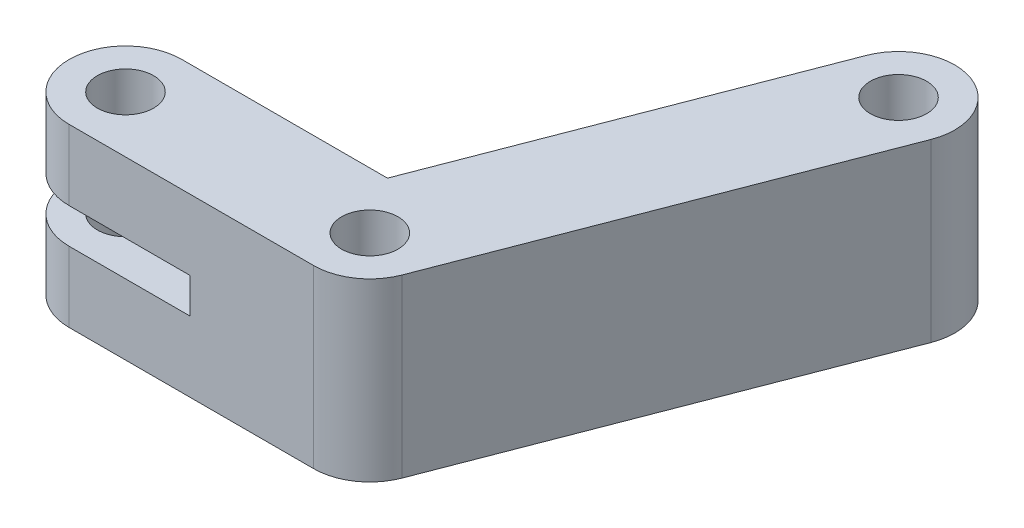
ISO-10303-21;
HEADER;
FILE_DESCRIPTION(('STEP AP214'),'2;1');
FILE_NAME('part.step','',(''),(''),'','','');
FILE_SCHEMA(('AUTOMOTIVE_DESIGN { 1 0 10303 214 1 1 1 1 }'));
ENDSEC;
DATA;
#1=APPLICATION_CONTEXT('core data for automotive mechanical design processes');
#2=APPLICATION_PROTOCOL_DEFINITION('international standard','automotive_design',2000,#1);
#3=PRODUCT_CONTEXT('',#1,'mechanical');
#4=PRODUCT('Part','Part','',(#3));
#5=PRODUCT_RELATED_PRODUCT_CATEGORY('part','',(#4));
#6=PRODUCT_DEFINITION_FORMATION('','',#4);
#7=PRODUCT_DEFINITION_CONTEXT('part definition',#1,'design');
#8=PRODUCT_DEFINITION('design','',#6,#7);
#9=PRODUCT_DEFINITION_SHAPE('','',#8);
#10=(LENGTH_UNIT() NAMED_UNIT(*) SI_UNIT(.MILLI.,.METRE.));
#11=(NAMED_UNIT(*) PLANE_ANGLE_UNIT() SI_UNIT($,.RADIAN.));
#12=(NAMED_UNIT(*) SI_UNIT($,.STERADIAN.) SOLID_ANGLE_UNIT());
#13=UNCERTAINTY_MEASURE_WITH_UNIT(LENGTH_MEASURE(1.E-05),#10,'distance_accuracy_value','');
#14=(GEOMETRIC_REPRESENTATION_CONTEXT(3) GLOBAL_UNCERTAINTY_ASSIGNED_CONTEXT((#13)) GLOBAL_UNIT_ASSIGNED_CONTEXT((#10,
#11,#12)) REPRESENTATION_CONTEXT('',''));
#15=CARTESIAN_POINT('',(0.,0.,0.));
#16=DIRECTION('',(0.,0.,1.));
#17=DIRECTION('',(1.,0.,0.));
#18=AXIS2_PLACEMENT_3D('',#15,#16,#17);
#19=CARTESIAN_POINT('',(0.,12.5,0.));
#20=DIRECTION('',(0.,-1.,0.));
#21=DIRECTION('',(0.,0.,-1.));
#22=AXIS2_PLACEMENT_3D('',#19,#20,#21);
#23=CYLINDRICAL_SURFACE('',#22,8.);
#24=DIRECTION('',(0.,-1.,0.));
#25=VECTOR('',#24,1.);
#26=CARTESIAN_POINT('',(0.,12.5,8.));
#27=LINE('',#26,#25);
#28=CARTESIAN_POINT('',(0.,-2.5,8.));
#29=VERTEX_POINT('',#28);
#30=CARTESIAN_POINT('',(0.,-12.5,8.));
#31=VERTEX_POINT('',#30);
#32=EDGE_CURVE('E47',#29,#31,#27,.T.);
#33=ORIENTED_EDGE('',*,*,#32,.F.);
#34=CARTESIAN_POINT('',(0.,-2.5,0.));
#35=DIRECTION('',(0.,-1.,0.));
#36=DIRECTION('',(0.,0.,-1.));
#37=AXIS2_PLACEMENT_3D('',#34,#35,#36);
#38=CIRCLE('',#37,8.);
#39=CARTESIAN_POINT('',(0.,-2.5,-8.));
#40=VERTEX_POINT('',#39);
#41=EDGE_CURVE('E273',#40,#29,#38,.F.);
#42=ORIENTED_EDGE('',*,*,#41,.F.);
#43=DIRECTION('',(0.,-1.,0.));
#44=VECTOR('',#43,1.);
#45=CARTESIAN_POINT('',(0.,12.5,-8.));
#46=LINE('',#45,#44);
#47=CARTESIAN_POINT('',(0.,-12.5,-8.));
#48=VERTEX_POINT('',#47);
#49=EDGE_CURVE('E94',#40,#48,#46,.T.);
#50=ORIENTED_EDGE('',*,*,#49,.T.);
#51=CARTESIAN_POINT('',(0.,-12.5,0.));
#52=DIRECTION('',(0.,1.,0.));
#53=DIRECTION('',(0.,0.,1.));
#54=AXIS2_PLACEMENT_3D('',#51,#52,#53);
#55=CIRCLE('',#54,8.);
#56=EDGE_CURVE('E143',#48,#31,#55,.T.);
#57=ORIENTED_EDGE('',*,*,#56,.T.);
#58=EDGE_LOOP('',(#33,#42,#50,#57));
#59=FACE_BOUND('',#58,.T.);
#60=ADVANCED_FACE('F39',(#59),#23,.T.);
#61=CARTESIAN_POINT('',(0.,12.5,0.));
#62=DIRECTION('',(0.,-1.,0.));
#63=DIRECTION('',(0.,0.,-1.));
#64=AXIS2_PLACEMENT_3D('',#61,#62,#63);
#65=CYLINDRICAL_SURFACE('',#64,4.);
#66=CARTESIAN_POINT('',(0.,-2.5,0.));
#67=DIRECTION('',(0.,-1.,0.));
#68=DIRECTION('',(0.,0.,-1.));
#69=AXIS2_PLACEMENT_3D('',#66,#67,#68);
#70=CIRCLE('',#69,4.);
#71=CARTESIAN_POINT('',(0.,-2.5,-4.));
#72=VERTEX_POINT('',#71);
#73=EDGE_CURVE('E270',#72,#72,#70,.F.);
#74=ORIENTED_EDGE('',*,*,#73,.T.);
#75=EDGE_LOOP('',(#74));
#76=FACE_BOUND('',#75,.T.);
#77=CARTESIAN_POINT('',(0.,-12.5,0.));
#78=DIRECTION('',(0.,1.,0.));
#79=DIRECTION('',(0.,0.,1.));
#80=AXIS2_PLACEMENT_3D('',#77,#78,#79);
#81=CIRCLE('',#80,4.);
#82=CARTESIAN_POINT('',(0.,-12.5,4.));
#83=VERTEX_POINT('',#82);
#84=EDGE_CURVE('E227',#83,#83,#81,.T.);
#85=ORIENTED_EDGE('',*,*,#84,.F.);
#86=EDGE_LOOP('',(#85));
#87=FACE_BOUND('',#86,.T.);
#88=ADVANCED_FACE('F185',(#76,#87),#65,.F.);
#89=CARTESIAN_POINT('',(0.,12.5,0.));
#90=DIRECTION('',(0.,1.,0.));
#91=DIRECTION('',(0.,0.,1.));
#92=AXIS2_PLACEMENT_3D('',#89,#90,#91);
#93=PLANE('',#92);
#94=CARTESIAN_POINT('',(0.,12.5,0.));
#95=DIRECTION('',(0.,1.,0.));
#96=DIRECTION('',(0.,0.,1.));
#97=AXIS2_PLACEMENT_3D('',#94,#95,#96);
#98=CIRCLE('',#97,4.);
#99=CARTESIAN_POINT('',(0.,12.5,4.));
#100=VERTEX_POINT('',#99);
#101=EDGE_CURVE('E229',#100,#100,#98,.T.);
#102=ORIENTED_EDGE('',*,*,#101,.F.);
#103=EDGE_LOOP('',(#102));
#104=FACE_BOUND('',#103,.T.);
#105=CARTESIAN_POINT('',(0.,12.5,0.));
#106=DIRECTION('',(0.,1.,0.));
#107=DIRECTION('',(0.,0.,1.));
#108=AXIS2_PLACEMENT_3D('',#105,#106,#107);
#109=CIRCLE('',#108,8.);
#110=CARTESIAN_POINT('',(0.,12.5,-8.));
#111=VERTEX_POINT('',#110);
#112=CARTESIAN_POINT('',(0.,12.5,8.));
#113=VERTEX_POINT('',#112);
#114=EDGE_CURVE('E157',#111,#113,#109,.T.);
#115=ORIENTED_EDGE('',*,*,#114,.T.);
#116=DIRECTION('',(1.,0.,0.));
#117=VECTOR('',#116,1.);
#118=CARTESIAN_POINT('',(0.,12.5,8.));
#119=LINE('',#118,#117);
#120=CARTESIAN_POINT('',(34.72,12.5,8.));
#121=VERTEX_POINT('',#120);
#122=EDGE_CURVE('E102',#113,#121,#119,.T.);
#123=ORIENTED_EDGE('',*,*,#122,.T.);
#124=CARTESIAN_POINT('',(34.72,12.5,0.));
#125=DIRECTION('',(0.,1.,0.));
#126=DIRECTION('',(0.,0.,-1.));
#127=AXIS2_PLACEMENT_3D('',#124,#125,#126);
#128=CIRCLE('',#127,8.);
#129=CARTESIAN_POINT('',(42.1854515483824,12.5,2.87524489022324));
#130=VERTEX_POINT('',#129);
#131=EDGE_CURVE('E241',#121,#130,#128,.T.);
#132=ORIENTED_EDGE('',*,*,#131,.T.);
#133=DIRECTION('',(0.359405611277904,0.,-0.9331814435478));
#134=VECTOR('',#133,1.);
#135=CARTESIAN_POINT('',(63.0754515483824,12.5,-51.3647551097768));
#136=LINE('',#135,#134);
#137=CARTESIAN_POINT('',(63.0754515483824,12.5,-51.3647551097768));
#138=VERTEX_POINT('',#137);
#139=EDGE_CURVE('E122',#130,#138,#136,.T.);
#140=ORIENTED_EDGE('',*,*,#139,.T.);
#141=CARTESIAN_POINT('',(55.61,12.5,-54.24));
#142=DIRECTION('',(0.,1.,0.));
#143=DIRECTION('',(0.,0.,-1.));
#144=AXIS2_PLACEMENT_3D('',#141,#142,#143);
#145=CIRCLE('',#144,8.);
#146=CARTESIAN_POINT('',(48.1445484516176,12.5,-57.1152448902232));
#147=VERTEX_POINT('',#146);
#148=EDGE_CURVE('E114',#138,#147,#145,.T.);
#149=ORIENTED_EDGE('',*,*,#148,.T.);
#150=DIRECTION('',(-0.359405611277904,0.,0.9331814435478));
#151=VECTOR('',#150,1.);
#152=CARTESIAN_POINT('',(29.2282972392879,12.5,-8.));
#153=LINE('',#152,#151);
#154=CARTESIAN_POINT('',(29.2282972392879,12.5,-8.));
#155=VERTEX_POINT('',#154);
#156=EDGE_CURVE('E119',#147,#155,#153,.T.);
#157=ORIENTED_EDGE('',*,*,#156,.T.);
#158=DIRECTION('',(-1.,0.,0.));
#159=VECTOR('',#158,1.);
#160=CARTESIAN_POINT('',(0.,12.5,-8.));
#161=LINE('',#160,#159);
#162=EDGE_CURVE('E63',#155,#111,#161,.T.);
#163=ORIENTED_EDGE('',*,*,#162,.T.);
#164=EDGE_LOOP('',(#115,#123,#132,#140,#149,#157,#163));
#165=FACE_BOUND('',#164,.T.);
#166=CARTESIAN_POINT('',(55.61,12.5,-54.24));
#167=DIRECTION('',(0.,1.,0.));
#168=DIRECTION('',(0.,0.,1.));
#169=AXIS2_PLACEMENT_3D('',#166,#167,#168);
#170=CIRCLE('',#169,4.00000000000001);
#171=CARTESIAN_POINT('',(55.61,12.5,-50.24));
#172=VERTEX_POINT('',#171);
#173=EDGE_CURVE('E146',#172,#172,#170,.T.);
#174=ORIENTED_EDGE('',*,*,#173,.F.);
#175=EDGE_LOOP('',(#174));
#176=FACE_BOUND('',#175,.T.);
#177=CARTESIAN_POINT('',(34.72,12.5,0.));
#178=DIRECTION('',(0.,1.,0.));
#179=DIRECTION('',(0.,0.,1.));
#180=AXIS2_PLACEMENT_3D('',#177,#178,#179);
#181=CIRCLE('',#180,4.00000000000001);
#182=CARTESIAN_POINT('',(34.72,12.5,4.00000000000001));
#183=VERTEX_POINT('',#182);
#184=EDGE_CURVE('E217',#183,#183,#181,.T.);
#185=ORIENTED_EDGE('',*,*,#184,.F.);
#186=EDGE_LOOP('',(#185));
#187=FACE_BOUND('',#186,.T.);
#188=ADVANCED_FACE('F116',(#104,#165,#176,#187),#93,.T.);
#189=CARTESIAN_POINT('',(0.,-12.5,0.));
#190=DIRECTION('',(0.,1.,0.));
#191=DIRECTION('',(0.,0.,1.));
#192=AXIS2_PLACEMENT_3D('',#189,#190,#191);
#193=PLANE('',#192);
#194=ORIENTED_EDGE('',*,*,#56,.F.);
#195=DIRECTION('',(-1.,0.,0.));
#196=VECTOR('',#195,1.);
#197=CARTESIAN_POINT('',(0.,-12.5,-8.));
#198=LINE('',#197,#196);
#199=CARTESIAN_POINT('',(29.2282972392879,-12.5,-8.));
#200=VERTEX_POINT('',#199);
#201=EDGE_CURVE('E155',#200,#48,#198,.T.);
#202=ORIENTED_EDGE('',*,*,#201,.F.);
#203=DIRECTION('',(-0.359405611277904,0.,0.9331814435478));
#204=VECTOR('',#203,1.);
#205=CARTESIAN_POINT('',(29.2282972392879,-12.5,-8.));
#206=LINE('',#205,#204);
#207=CARTESIAN_POINT('',(48.1445484516176,-12.5,-57.1152448902232));
#208=VERTEX_POINT('',#207);
#209=EDGE_CURVE('E153',#208,#200,#206,.T.);
#210=ORIENTED_EDGE('',*,*,#209,.F.);
#211=CARTESIAN_POINT('',(55.61,-12.5,-54.24));
#212=DIRECTION('',(0.,1.,0.));
#213=DIRECTION('',(0.,0.,-1.));
#214=AXIS2_PLACEMENT_3D('',#211,#212,#213);
#215=CIRCLE('',#214,8.);
#216=CARTESIAN_POINT('',(63.0754515483824,-12.5,-51.3647551097768));
#217=VERTEX_POINT('',#216);
#218=EDGE_CURVE('E131',#217,#208,#215,.T.);
#219=ORIENTED_EDGE('',*,*,#218,.F.);
#220=DIRECTION('',(0.359405611277904,0.,-0.9331814435478));
#221=VECTOR('',#220,1.);
#222=CARTESIAN_POINT('',(63.0754515483824,-12.5,-51.3647551097768));
#223=LINE('',#222,#221);
#224=CARTESIAN_POINT('',(42.1854515483824,-12.5,2.87524489022324));
#225=VERTEX_POINT('',#224);
#226=EDGE_CURVE('E150',#225,#217,#223,.T.);
#227=ORIENTED_EDGE('',*,*,#226,.F.);
#228=CARTESIAN_POINT('',(34.72,-12.5,0.));
#229=DIRECTION('',(0.,1.,0.));
#230=DIRECTION('',(0.,0.,-1.));
#231=AXIS2_PLACEMENT_3D('',#228,#229,#230);
#232=CIRCLE('',#231,8.);
#233=CARTESIAN_POINT('',(34.72,-12.5,8.));
#234=VERTEX_POINT('',#233);
#235=EDGE_CURVE('E148',#234,#225,#232,.T.);
#236=ORIENTED_EDGE('',*,*,#235,.F.);
#237=DIRECTION('',(1.,0.,0.));
#238=VECTOR('',#237,1.);
#239=CARTESIAN_POINT('',(0.,-12.5,8.));
#240=LINE('',#239,#238);
#241=EDGE_CURVE('E145',#31,#234,#240,.T.);
#242=ORIENTED_EDGE('',*,*,#241,.F.);
#243=EDGE_LOOP('',(#194,#202,#210,#219,#227,#236,#242));
#244=FACE_BOUND('',#243,.T.);
#245=CARTESIAN_POINT('',(55.61,-12.5,-54.24));
#246=DIRECTION('',(0.,1.,0.));
#247=DIRECTION('',(0.,0.,1.));
#248=AXIS2_PLACEMENT_3D('',#245,#246,#247);
#249=CIRCLE('',#248,4.00000000000001);
#250=CARTESIAN_POINT('',(55.61,-12.5,-50.24));
#251=VERTEX_POINT('',#250);
#252=EDGE_CURVE('E232',#251,#251,#249,.T.);
#253=ORIENTED_EDGE('',*,*,#252,.T.);
#254=EDGE_LOOP('',(#253));
#255=FACE_BOUND('',#254,.T.);
#256=ORIENTED_EDGE('',*,*,#84,.T.);
#257=EDGE_LOOP('',(#256));
#258=FACE_BOUND('',#257,.T.);
#259=CARTESIAN_POINT('',(34.72,-12.5,0.));
#260=DIRECTION('',(0.,1.,0.));
#261=DIRECTION('',(0.,0.,1.));
#262=AXIS2_PLACEMENT_3D('',#259,#260,#261);
#263=CIRCLE('',#262,4.00000000000001);
#264=CARTESIAN_POINT('',(34.72,-12.5,4.00000000000001));
#265=VERTEX_POINT('',#264);
#266=EDGE_CURVE('E213',#265,#265,#263,.T.);
#267=ORIENTED_EDGE('',*,*,#266,.T.);
#268=EDGE_LOOP('',(#267));
#269=FACE_BOUND('',#268,.T.);
#270=ADVANCED_FACE('F180',(#244,#255,#258,#269),#193,.F.);
#271=CARTESIAN_POINT('',(0.,2.5,-8.));
#272=VERTEX_POINT('',#271);
#273=EDGE_CURVE('E158',#111,#272,#46,.T.);
#274=ORIENTED_EDGE('',*,*,#273,.T.);
#275=CARTESIAN_POINT('',(0.,2.5,0.));
#276=DIRECTION('',(0.,1.,0.));
#277=DIRECTION('',(0.,0.,1.));
#278=AXIS2_PLACEMENT_3D('',#275,#276,#277);
#279=CIRCLE('',#278,8.);
#280=CARTESIAN_POINT('',(0.,2.5,8.));
#281=VERTEX_POINT('',#280);
#282=EDGE_CURVE('E54',#281,#272,#279,.F.);
#283=ORIENTED_EDGE('',*,*,#282,.F.);
#284=EDGE_CURVE('E11',#113,#281,#27,.T.);
#285=ORIENTED_EDGE('',*,*,#284,.F.);
#286=ORIENTED_EDGE('',*,*,#114,.F.);
#287=EDGE_LOOP('',(#274,#283,#285,#286));
#288=FACE_BOUND('',#287,.T.);
#289=ADVANCED_FACE('F41',(#288),#23,.T.);
#290=CARTESIAN_POINT('',(0.,12.5,8.));
#291=DIRECTION('',(0.,0.,-1.));
#292=DIRECTION('',(-1.,0.,0.));
#293=AXIS2_PLACEMENT_3D('',#290,#291,#292);
#294=PLANE('',#293);
#295=DIRECTION('',(0.,1.,0.));
#296=VECTOR('',#295,1.);
#297=CARTESIAN_POINT('',(17.15,-2.5,8.));
#298=LINE('',#297,#296);
#299=CARTESIAN_POINT('',(17.15,-2.5,8.));
#300=VERTEX_POINT('',#299);
#301=CARTESIAN_POINT('',(17.15,2.5,8.));
#302=VERTEX_POINT('',#301);
#303=EDGE_CURVE('E263',#300,#302,#298,.T.);
#304=ORIENTED_EDGE('',*,*,#303,.F.);
#305=DIRECTION('',(1.,0.,0.));
#306=VECTOR('',#305,1.);
#307=CARTESIAN_POINT('',(-8.,-2.5,8.));
#308=LINE('',#307,#306);
#309=EDGE_CURVE('E177',#29,#300,#308,.T.);
#310=ORIENTED_EDGE('',*,*,#309,.F.);
#311=ORIENTED_EDGE('',*,*,#32,.T.);
#312=ORIENTED_EDGE('',*,*,#241,.T.);
#313=DIRECTION('',(0.,-1.,0.));
#314=VECTOR('',#313,1.);
#315=CARTESIAN_POINT('',(34.72,12.5,8.));
#316=LINE('',#315,#314);
#317=EDGE_CURVE('E165',#121,#234,#316,.T.);
#318=ORIENTED_EDGE('',*,*,#317,.F.);
#319=ORIENTED_EDGE('',*,*,#122,.F.);
#320=ORIENTED_EDGE('',*,*,#284,.T.);
#321=DIRECTION('',(-1.,0.,0.));
#322=VECTOR('',#321,1.);
#323=CARTESIAN_POINT('',(-8.,2.5,8.));
#324=LINE('',#323,#322);
#325=EDGE_CURVE('E260',#302,#281,#324,.T.);
#326=ORIENTED_EDGE('',*,*,#325,.F.);
#327=EDGE_LOOP('',(#304,#310,#311,#312,#318,#319,#320,#326));
#328=FACE_BOUND('',#327,.T.);
#329=ADVANCED_FACE('F174',(#328),#294,.F.);
#330=CARTESIAN_POINT('',(34.72,12.5,0.));
#331=DIRECTION('',(0.,-1.,0.));
#332=DIRECTION('',(0.,0.,-1.));
#333=AXIS2_PLACEMENT_3D('',#330,#331,#332);
#334=CYLINDRICAL_SURFACE('',#333,8.);
#335=ORIENTED_EDGE('',*,*,#235,.T.);
#336=DIRECTION('',(0.,-1.,0.));
#337=VECTOR('',#336,1.);
#338=CARTESIAN_POINT('',(42.1854515483824,12.5,2.87524489022324));
#339=LINE('',#338,#337);
#340=EDGE_CURVE('E163',#130,#225,#339,.T.);
#341=ORIENTED_EDGE('',*,*,#340,.F.);
#342=ORIENTED_EDGE('',*,*,#131,.F.);
#343=ORIENTED_EDGE('',*,*,#317,.T.);
#344=EDGE_LOOP('',(#335,#341,#342,#343));
#345=FACE_BOUND('',#344,.T.);
#346=ADVANCED_FACE('F198',(#345),#334,.T.);
#347=CARTESIAN_POINT('',(63.0754515483824,12.5,-51.3647551097768));
#348=DIRECTION('',(-0.9331814435478,0.,-0.359405611277904));
#349=DIRECTION('',(-0.359405611277904,0.,0.9331814435478));
#350=AXIS2_PLACEMENT_3D('',#347,#348,#349);
#351=PLANE('',#350);
#352=ORIENTED_EDGE('',*,*,#226,.T.);
#353=DIRECTION('',(0.,-1.,0.));
#354=VECTOR('',#353,1.);
#355=CARTESIAN_POINT('',(63.0754515483824,12.5,-51.3647551097768));
#356=LINE('',#355,#354);
#357=EDGE_CURVE('E134',#138,#217,#356,.T.);
#358=ORIENTED_EDGE('',*,*,#357,.F.);
#359=ORIENTED_EDGE('',*,*,#139,.F.);
#360=ORIENTED_EDGE('',*,*,#340,.T.);
#361=EDGE_LOOP('',(#352,#358,#359,#360));
#362=FACE_BOUND('',#361,.T.);
#363=ADVANCED_FACE('F244',(#362),#351,.F.);
#364=CARTESIAN_POINT('',(55.61,12.5,-54.24));
#365=DIRECTION('',(0.,-1.,0.));
#366=DIRECTION('',(0.,0.,-1.));
#367=AXIS2_PLACEMENT_3D('',#364,#365,#366);
#368=CYLINDRICAL_SURFACE('',#367,8.);
#369=ORIENTED_EDGE('',*,*,#218,.T.);
#370=DIRECTION('',(0.,-1.,0.));
#371=VECTOR('',#370,1.);
#372=CARTESIAN_POINT('',(48.1445484516176,12.5,-57.1152448902232));
#373=LINE('',#372,#371);
#374=EDGE_CURVE('E128',#147,#208,#373,.T.);
#375=ORIENTED_EDGE('',*,*,#374,.F.);
#376=ORIENTED_EDGE('',*,*,#148,.F.);
#377=ORIENTED_EDGE('',*,*,#357,.T.);
#378=EDGE_LOOP('',(#369,#375,#376,#377));
#379=FACE_BOUND('',#378,.T.);
#380=ADVANCED_FACE('F129',(#379),#368,.T.);
#381=CARTESIAN_POINT('',(29.2282972392879,12.5,-8.));
#382=DIRECTION('',(0.9331814435478,0.,0.359405611277904));
#383=DIRECTION('',(0.359405611277904,0.,-0.9331814435478));
#384=AXIS2_PLACEMENT_3D('',#381,#382,#383);
#385=PLANE('',#384);
#386=ORIENTED_EDGE('',*,*,#209,.T.);
#387=DIRECTION('',(0.,-1.,0.));
#388=VECTOR('',#387,1.);
#389=CARTESIAN_POINT('',(29.2282972392879,12.5,-8.));
#390=LINE('',#389,#388);
#391=EDGE_CURVE('E135',#155,#200,#390,.T.);
#392=ORIENTED_EDGE('',*,*,#391,.F.);
#393=ORIENTED_EDGE('',*,*,#156,.F.);
#394=ORIENTED_EDGE('',*,*,#374,.T.);
#395=EDGE_LOOP('',(#386,#392,#393,#394));
#396=FACE_BOUND('',#395,.T.);
#397=ADVANCED_FACE('F137',(#396),#385,.F.);
#398=CARTESIAN_POINT('',(0.,12.5,-8.));
#399=DIRECTION('',(0.,0.,1.));
#400=DIRECTION('',(1.,0.,0.));
#401=AXIS2_PLACEMENT_3D('',#398,#399,#400);
#402=PLANE('',#401);
#403=ORIENTED_EDGE('',*,*,#49,.F.);
#404=DIRECTION('',(-1.,0.,0.));
#405=VECTOR('',#404,1.);
#406=CARTESIAN_POINT('',(-8.,-2.5,-8.));
#407=LINE('',#406,#405);
#408=CARTESIAN_POINT('',(17.15,-2.5,-8.));
#409=VERTEX_POINT('',#408);
#410=EDGE_CURVE('E247',#409,#40,#407,.T.);
#411=ORIENTED_EDGE('',*,*,#410,.F.);
#412=DIRECTION('',(0.,-1.,0.));
#413=VECTOR('',#412,1.);
#414=CARTESIAN_POINT('',(17.15,-2.5,-8.));
#415=LINE('',#414,#413);
#416=CARTESIAN_POINT('',(17.15,2.5,-8.));
#417=VERTEX_POINT('',#416);
#418=EDGE_CURVE('E211',#417,#409,#415,.T.);
#419=ORIENTED_EDGE('',*,*,#418,.F.);
#420=DIRECTION('',(1.,0.,0.));
#421=VECTOR('',#420,1.);
#422=CARTESIAN_POINT('',(-8.,2.5,-8.));
#423=LINE('',#422,#421);
#424=EDGE_CURVE('E207',#272,#417,#423,.T.);
#425=ORIENTED_EDGE('',*,*,#424,.F.);
#426=ORIENTED_EDGE('',*,*,#273,.F.);
#427=ORIENTED_EDGE('',*,*,#162,.F.);
#428=ORIENTED_EDGE('',*,*,#391,.T.);
#429=ORIENTED_EDGE('',*,*,#201,.T.);
#430=EDGE_LOOP('',(#403,#411,#419,#425,#426,#427,#428,#429));
#431=FACE_BOUND('',#430,.T.);
#432=ADVANCED_FACE('F205',(#431),#402,.F.);
#433=CARTESIAN_POINT('',(55.61,12.5,-54.24));
#434=DIRECTION('',(0.,-1.,0.));
#435=DIRECTION('',(0.,0.,-1.));
#436=AXIS2_PLACEMENT_3D('',#433,#434,#435);
#437=CYLINDRICAL_SURFACE('',#436,4.00000000000001);
#438=ORIENTED_EDGE('',*,*,#173,.T.);
#439=EDGE_LOOP('',(#438));
#440=FACE_BOUND('',#439,.T.);
#441=ORIENTED_EDGE('',*,*,#252,.F.);
#442=EDGE_LOOP('',(#441));
#443=FACE_BOUND('',#442,.T.);
#444=ADVANCED_FACE('F297',(#440,#443),#437,.F.);
#445=CARTESIAN_POINT('',(0.,2.5,0.));
#446=DIRECTION('',(0.,1.,0.));
#447=DIRECTION('',(0.,0.,1.));
#448=AXIS2_PLACEMENT_3D('',#445,#446,#447);
#449=CIRCLE('',#448,4.);
#450=CARTESIAN_POINT('',(0.,2.5,4.));
#451=VERTEX_POINT('',#450);
#452=EDGE_CURVE('E224',#451,#451,#449,.F.);
#453=ORIENTED_EDGE('',*,*,#452,.T.);
#454=EDGE_LOOP('',(#453));
#455=FACE_BOUND('',#454,.T.);
#456=ORIENTED_EDGE('',*,*,#101,.T.);
#457=EDGE_LOOP('',(#456));
#458=FACE_BOUND('',#457,.T.);
#459=ADVANCED_FACE('F192',(#455,#458),#65,.F.);
#460=CARTESIAN_POINT('',(34.72,12.5,0.));
#461=DIRECTION('',(0.,-1.,0.));
#462=DIRECTION('',(0.,0.,-1.));
#463=AXIS2_PLACEMENT_3D('',#460,#461,#462);
#464=CYLINDRICAL_SURFACE('',#463,4.00000000000001);
#465=ORIENTED_EDGE('',*,*,#184,.T.);
#466=EDGE_LOOP('',(#465));
#467=FACE_BOUND('',#466,.T.);
#468=ORIENTED_EDGE('',*,*,#266,.F.);
#469=EDGE_LOOP('',(#468));
#470=FACE_BOUND('',#469,.T.);
#471=ADVANCED_FACE('F292',(#467,#470),#464,.F.);
#472=CARTESIAN_POINT('',(17.15,-2.5,-62.241));
#473=DIRECTION('',(1.,0.,0.));
#474=DIRECTION('',(0.,0.,-1.));
#475=AXIS2_PLACEMENT_3D('',#472,#473,#474);
#476=PLANE('',#475);
#477=ORIENTED_EDGE('',*,*,#418,.T.);
#478=DIRECTION('',(0.,0.,1.));
#479=VECTOR('',#478,1.);
#480=CARTESIAN_POINT('',(17.15,-2.5,-62.241));
#481=LINE('',#480,#479);
#482=EDGE_CURVE('E214',#409,#300,#481,.T.);
#483=ORIENTED_EDGE('',*,*,#482,.T.);
#484=ORIENTED_EDGE('',*,*,#303,.T.);
#485=DIRECTION('',(0.,0.,1.));
#486=VECTOR('',#485,1.);
#487=CARTESIAN_POINT('',(17.15,2.5,-62.241));
#488=LINE('',#487,#486);
#489=EDGE_CURVE('E220',#417,#302,#488,.T.);
#490=ORIENTED_EDGE('',*,*,#489,.F.);
#491=EDGE_LOOP('',(#477,#483,#484,#490));
#492=FACE_BOUND('',#491,.T.);
#493=ADVANCED_FACE('F286',(#492),#476,.F.);
#494=CARTESIAN_POINT('',(-8.,-2.5,-62.241));
#495=DIRECTION('',(0.,-1.,0.));
#496=DIRECTION('',(0.,0.,-1.));
#497=AXIS2_PLACEMENT_3D('',#494,#495,#496);
#498=PLANE('',#497);
#499=ORIENTED_EDGE('',*,*,#73,.F.);
#500=EDGE_LOOP('',(#499));
#501=FACE_BOUND('',#500,.T.);
#502=ORIENTED_EDGE('',*,*,#41,.T.);
#503=ORIENTED_EDGE('',*,*,#309,.T.);
#504=ORIENTED_EDGE('',*,*,#482,.F.);
#505=ORIENTED_EDGE('',*,*,#410,.T.);
#506=EDGE_LOOP('',(#502,#503,#504,#505));
#507=FACE_BOUND('',#506,.T.);
#508=ADVANCED_FACE('F281',(#501,#507),#498,.F.);
#509=CARTESIAN_POINT('',(-8.,2.5,-62.241));
#510=DIRECTION('',(0.,1.,0.));
#511=DIRECTION('',(0.,0.,1.));
#512=AXIS2_PLACEMENT_3D('',#509,#510,#511);
#513=PLANE('',#512);
#514=ORIENTED_EDGE('',*,*,#452,.F.);
#515=EDGE_LOOP('',(#514));
#516=FACE_BOUND('',#515,.T.);
#517=ORIENTED_EDGE('',*,*,#282,.T.);
#518=ORIENTED_EDGE('',*,*,#424,.T.);
#519=ORIENTED_EDGE('',*,*,#489,.T.);
#520=ORIENTED_EDGE('',*,*,#325,.T.);
#521=EDGE_LOOP('',(#517,#518,#519,#520));
#522=FACE_BOUND('',#521,.T.);
#523=ADVANCED_FACE('F261',(#516,#522),#513,.F.);
#524=CLOSED_SHELL('',(#60,#88,#188,#270,#289,#329,#346,#363,#380,#397,#432,#444,#459,#471,#493,
#508,#523));
#525=MANIFOLD_SOLID_BREP('B2',#524);
#526=ADVANCED_BREP_SHAPE_REPRESENTATION('',(#18,#525),#14);
#527=SHAPE_DEFINITION_REPRESENTATION(#9,#526);
ENDSEC;
END-ISO-10303-21;
